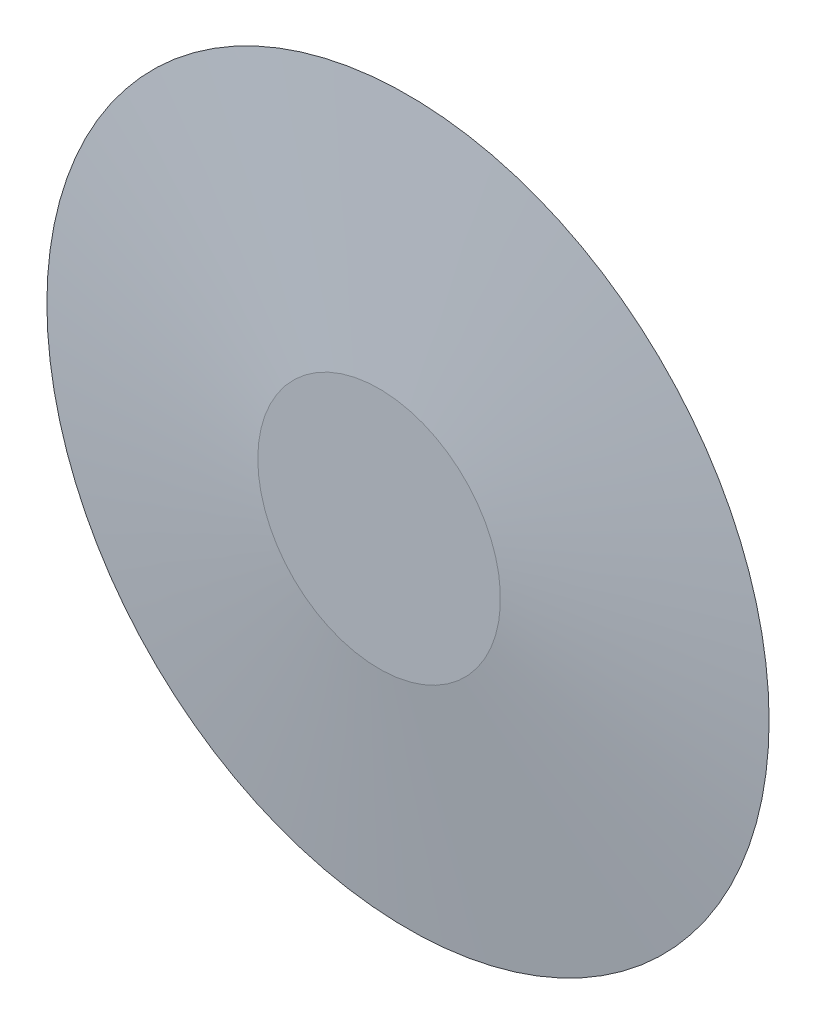
ISO-10303-21;
HEADER;
FILE_DESCRIPTION(('STEP AP214'),'2;1');
FILE_NAME('part.step','',(''),(''),'','','');
FILE_SCHEMA(('AUTOMOTIVE_DESIGN { 1 0 10303 214 1 1 1 1 }'));
ENDSEC;
DATA;
#1=APPLICATION_CONTEXT('core data for automotive mechanical design processes');
#2=APPLICATION_PROTOCOL_DEFINITION('international standard','automotive_design',2000,#1);
#3=PRODUCT_CONTEXT('',#1,'mechanical');
#4=PRODUCT('Part','Part','',(#3));
#5=PRODUCT_RELATED_PRODUCT_CATEGORY('part','',(#4));
#6=PRODUCT_DEFINITION_FORMATION('','',#4);
#7=PRODUCT_DEFINITION_CONTEXT('part definition',#1,'design');
#8=PRODUCT_DEFINITION('design','',#6,#7);
#9=PRODUCT_DEFINITION_SHAPE('','',#8);
#10=(LENGTH_UNIT() NAMED_UNIT(*) SI_UNIT(.MILLI.,.METRE.));
#11=(NAMED_UNIT(*) PLANE_ANGLE_UNIT() SI_UNIT($,.RADIAN.));
#12=(NAMED_UNIT(*) SI_UNIT($,.STERADIAN.) SOLID_ANGLE_UNIT());
#13=UNCERTAINTY_MEASURE_WITH_UNIT(LENGTH_MEASURE(1.E-05),#10,'distance_accuracy_value','');
#14=(GEOMETRIC_REPRESENTATION_CONTEXT(3) GLOBAL_UNCERTAINTY_ASSIGNED_CONTEXT((#13)) GLOBAL_UNIT_ASSIGNED_CONTEXT((#10,
#11,#12)) REPRESENTATION_CONTEXT('',''));
#15=CARTESIAN_POINT('',(0.,0.,0.));
#16=DIRECTION('',(0.,0.,1.));
#17=DIRECTION('',(1.,0.,0.));
#18=AXIS2_PLACEMENT_3D('',#15,#16,#17);
#19=CARTESIAN_POINT('',(0.,0.,24.5));
#20=DIRECTION('',(0.,0.,1.));
#21=DIRECTION('',(1.,0.,0.));
#22=AXIS2_PLACEMENT_3D('',#19,#20,#21);
#23=PLANE('',#22);
#24=CARTESIAN_POINT('',(0.,0.,24.500000000003));
#25=DIRECTION('',(0.,0.,-1.));
#26=DIRECTION('',(-1.,0.,0.));
#27=AXIS2_PLACEMENT_3D('',#24,#25,#26);
#28=CIRCLE('',#27,2.09999999998445);
#29=CARTESIAN_POINT('',(-2.09999999998445,0.,24.500000000003));
#30=VERTEX_POINT('',#29);
#31=EDGE_CURVE('E17',#30,#30,#28,.T.);
#32=ORIENTED_EDGE('',*,*,#31,.F.);
#33=EDGE_LOOP('',(#32));
#34=FACE_BOUND('',#33,.T.);
#35=ADVANCED_FACE('F14',(#34),#23,.T.);
#36=CARTESIAN_POINT('',(0.,0.,23.9999999999938));
#37=DIRECTION('',(0.,0.,-1.));
#38=DIRECTION('',(-1.,0.,0.));
#39=AXIS2_PLACEMENT_3D('',#36,#37,#38);
#40=CONICAL_SURFACE('',#39,6.25000000002274,1.45089234142877);
#41=CARTESIAN_POINT('',(0.,0.,23.9999999999938));
#42=DIRECTION('',(0.,0.,-1.));
#43=DIRECTION('',(-1.,0.,0.));
#44=AXIS2_PLACEMENT_3D('',#41,#42,#43);
#45=CIRCLE('',#44,6.25000000002274);
#46=CARTESIAN_POINT('',(-6.25000000002274,0.,23.9999999999938));
#47=VERTEX_POINT('',#46);
#48=EDGE_CURVE('E9',#47,#47,#45,.F.);
#49=ORIENTED_EDGE('',*,*,#48,.T.);
#50=EDGE_LOOP('',(#49));
#51=FACE_BOUND('',#50,.T.);
#52=ORIENTED_EDGE('',*,*,#31,.T.);
#53=EDGE_LOOP('',(#52));
#54=FACE_BOUND('',#53,.T.);
#55=ADVANCED_FACE('F26',(#51,#54),#40,.T.);
#56=CARTESIAN_POINT('',(0.,0.,24.));
#57=DIRECTION('',(0.,0.,1.));
#58=DIRECTION('',(1.,0.,0.));
#59=AXIS2_PLACEMENT_3D('',#56,#57,#58);
#60=PLANE('',#59);
#61=ORIENTED_EDGE('',*,*,#48,.F.);
#62=EDGE_LOOP('',(#61));
#63=FACE_BOUND('',#62,.T.);
#64=ADVANCED_FACE('F33',(#63),#60,.F.);
#65=CLOSED_SHELL('',(#35,#55,#64));
#66=MANIFOLD_SOLID_BREP('B1',#65);
#67=ADVANCED_BREP_SHAPE_REPRESENTATION('',(#18,#66),#14);
#68=SHAPE_DEFINITION_REPRESENTATION(#9,#67);
ENDSEC;
END-ISO-10303-21;
